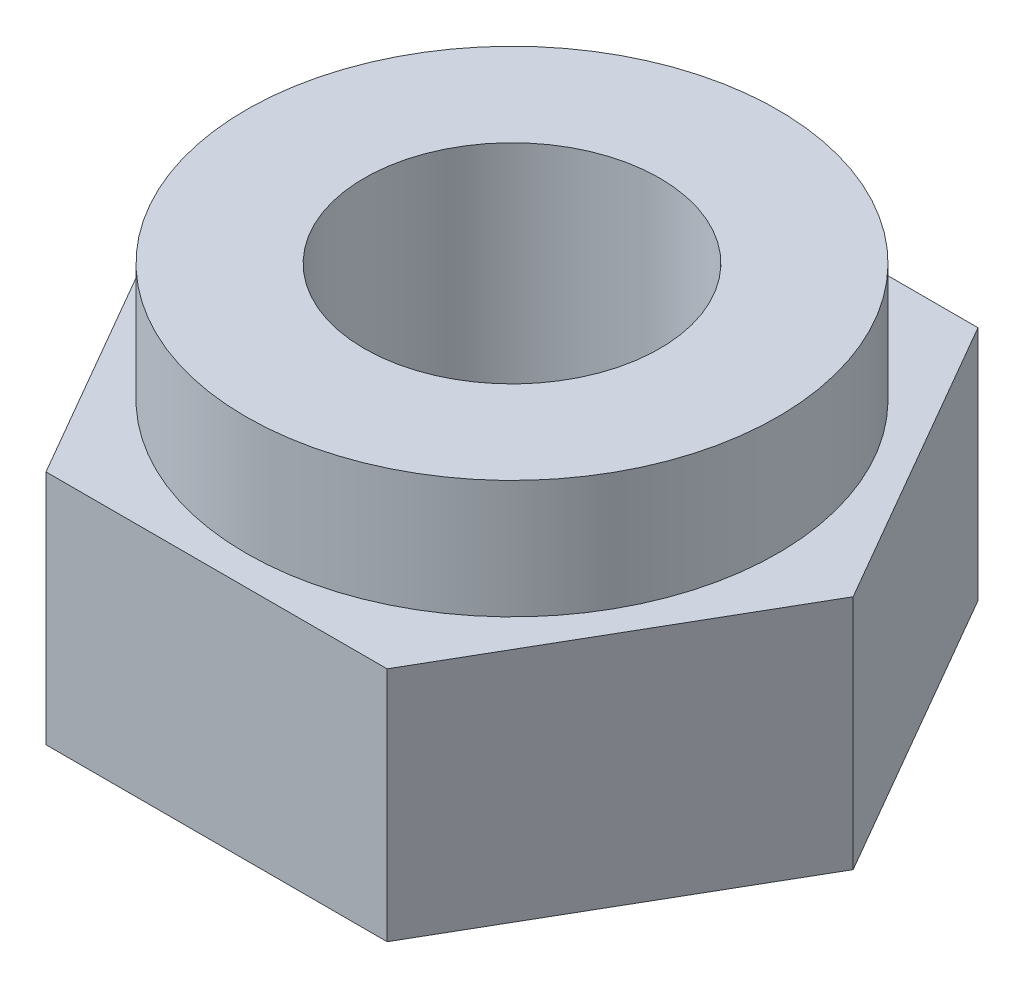
ISO-10303-21;
HEADER;
FILE_DESCRIPTION(('STEP AP214'),'2;1');
FILE_NAME('part.step','',(''),(''),'','','');
FILE_SCHEMA(('AUTOMOTIVE_DESIGN { 1 0 10303 214 1 1 1 1 }'));
ENDSEC;
DATA;
#1=APPLICATION_CONTEXT('core data for automotive mechanical design processes');
#2=APPLICATION_PROTOCOL_DEFINITION('international standard','automotive_design',2000,#1);
#3=PRODUCT_CONTEXT('',#1,'mechanical');
#4=PRODUCT('Part','Part','',(#3));
#5=PRODUCT_RELATED_PRODUCT_CATEGORY('part','',(#4));
#6=PRODUCT_DEFINITION_FORMATION('','',#4);
#7=PRODUCT_DEFINITION_CONTEXT('part definition',#1,'design');
#8=PRODUCT_DEFINITION('design','',#6,#7);
#9=PRODUCT_DEFINITION_SHAPE('','',#8);
#10=(LENGTH_UNIT() NAMED_UNIT(*) SI_UNIT(.MILLI.,.METRE.));
#11=(NAMED_UNIT(*) PLANE_ANGLE_UNIT() SI_UNIT($,.RADIAN.));
#12=(NAMED_UNIT(*) SI_UNIT($,.STERADIAN.) SOLID_ANGLE_UNIT());
#13=UNCERTAINTY_MEASURE_WITH_UNIT(LENGTH_MEASURE(1.E-05),#10,'distance_accuracy_value','');
#14=(GEOMETRIC_REPRESENTATION_CONTEXT(3) GLOBAL_UNCERTAINTY_ASSIGNED_CONTEXT((#13)) GLOBAL_UNIT_ASSIGNED_CONTEXT((#10,
#11,#12)) REPRESENTATION_CONTEXT('',''));
#15=CARTESIAN_POINT('',(0.,0.,0.));
#16=DIRECTION('',(0.,0.,1.));
#17=DIRECTION('',(1.,0.,0.));
#18=AXIS2_PLACEMENT_3D('',#15,#16,#17);
#19=CARTESIAN_POINT('',(1.44337567297409,3.,2.49999999999999));
#20=DIRECTION('',(-0.866025403784441,0.,-0.499999999999995));
#21=DIRECTION('',(-0.499999999999995,0.,0.866025403784442));
#22=AXIS2_PLACEMENT_3D('',#19,#20,#21);
#23=PLANE('',#22);
#24=DIRECTION('',(0.499999999999995,0.,-0.866025403784442));
#25=VECTOR('',#24,1.);
#26=CARTESIAN_POINT('',(1.44337567297409,2.,2.49999999999999));
#27=LINE('',#26,#25);
#28=CARTESIAN_POINT('',(1.44337567297409,2.,2.49999999999999));
#29=VERTEX_POINT('',#28);
#30=CARTESIAN_POINT('',(2.88675134594813,2.,0.));
#31=VERTEX_POINT('',#30);
#32=EDGE_CURVE('E91',#29,#31,#27,.T.);
#33=ORIENTED_EDGE('',*,*,#32,.F.);
#34=DIRECTION('',(0.,-1.,0.));
#35=VECTOR('',#34,1.);
#36=CARTESIAN_POINT('',(1.44337567297409,3.,2.49999999999999));
#37=LINE('',#36,#35);
#38=CARTESIAN_POINT('',(1.44337567297409,0.,2.49999999999999));
#39=VERTEX_POINT('',#38);
#40=EDGE_CURVE('E61',#29,#39,#37,.T.);
#41=ORIENTED_EDGE('',*,*,#40,.T.);
#42=DIRECTION('',(0.499999999999995,0.,-0.866025403784442));
#43=VECTOR('',#42,1.);
#44=CARTESIAN_POINT('',(1.44337567297409,0.,2.49999999999999));
#45=LINE('',#44,#43);
#46=CARTESIAN_POINT('',(2.88675134594813,0.,0.));
#47=VERTEX_POINT('',#46);
#48=EDGE_CURVE('E124',#39,#47,#45,.T.);
#49=ORIENTED_EDGE('',*,*,#48,.T.);
#50=DIRECTION('',(0.,-1.,0.));
#51=VECTOR('',#50,1.);
#52=CARTESIAN_POINT('',(2.88675134594813,3.,0.));
#53=LINE('',#52,#51);
#54=EDGE_CURVE('E47',#31,#47,#53,.T.);
#55=ORIENTED_EDGE('',*,*,#54,.F.);
#56=EDGE_LOOP('',(#33,#41,#49,#55));
#57=FACE_BOUND('',#56,.T.);
#58=ADVANCED_FACE('F40',(#57),#23,.F.);
#59=CARTESIAN_POINT('',(2.88675134594813,3.,0.));
#60=DIRECTION('',(-0.866025403784438,0.,0.500000000000001));
#61=DIRECTION('',(0.500000000000001,0.,0.866025403784438));
#62=AXIS2_PLACEMENT_3D('',#59,#60,#61);
#63=PLANE('',#62);
#64=DIRECTION('',(-0.500000000000001,0.,-0.866025403784438));
#65=VECTOR('',#64,1.);
#66=CARTESIAN_POINT('',(2.88675134594813,2.,0.));
#67=LINE('',#66,#65);
#68=CARTESIAN_POINT('',(1.44337567297406,2.,-2.50000000000001));
#69=VERTEX_POINT('',#68);
#70=EDGE_CURVE('E97',#31,#69,#67,.T.);
#71=ORIENTED_EDGE('',*,*,#70,.F.);
#72=ORIENTED_EDGE('',*,*,#54,.T.);
#73=DIRECTION('',(-0.500000000000001,0.,-0.866025403784438));
#74=VECTOR('',#73,1.);
#75=CARTESIAN_POINT('',(2.88675134594813,0.,0.));
#76=LINE('',#75,#74);
#77=CARTESIAN_POINT('',(1.44337567297406,0.,-2.50000000000001));
#78=VERTEX_POINT('',#77);
#79=EDGE_CURVE('E120',#47,#78,#76,.T.);
#80=ORIENTED_EDGE('',*,*,#79,.T.);
#81=DIRECTION('',(0.,-1.,0.));
#82=VECTOR('',#81,1.);
#83=CARTESIAN_POINT('',(1.44337567297406,3.,-2.50000000000001));
#84=LINE('',#83,#82);
#85=EDGE_CURVE('E114',#69,#78,#84,.T.);
#86=ORIENTED_EDGE('',*,*,#85,.F.);
#87=EDGE_LOOP('',(#71,#72,#80,#86));
#88=FACE_BOUND('',#87,.T.);
#89=ADVANCED_FACE('F118',(#88),#63,.F.);
#90=CARTESIAN_POINT('',(1.44337567297406,3.,-2.50000000000001));
#91=DIRECTION('',(0.,0.,1.));
#92=DIRECTION('',(1.,0.,0.));
#93=AXIS2_PLACEMENT_3D('',#90,#91,#92);
#94=PLANE('',#93);
#95=DIRECTION('',(-1.,0.,0.));
#96=VECTOR('',#95,1.);
#97=CARTESIAN_POINT('',(1.44337567297406,2.,-2.50000000000001));
#98=LINE('',#97,#96);
#99=CARTESIAN_POINT('',(-1.44337567297408,2.,-2.5));
#100=VERTEX_POINT('',#99);
#101=EDGE_CURVE('E151',#69,#100,#98,.T.);
#102=ORIENTED_EDGE('',*,*,#101,.F.);
#103=ORIENTED_EDGE('',*,*,#85,.T.);
#104=DIRECTION('',(-1.,0.,0.));
#105=VECTOR('',#104,1.);
#106=CARTESIAN_POINT('',(1.44337567297406,0.,-2.50000000000001));
#107=LINE('',#106,#105);
#108=CARTESIAN_POINT('',(-1.44337567297408,0.,-2.5));
#109=VERTEX_POINT('',#108);
#110=EDGE_CURVE('E127',#78,#109,#107,.T.);
#111=ORIENTED_EDGE('',*,*,#110,.T.);
#112=DIRECTION('',(0.,-1.,0.));
#113=VECTOR('',#112,1.);
#114=CARTESIAN_POINT('',(-1.44337567297408,3.,-2.5));
#115=LINE('',#114,#113);
#116=EDGE_CURVE('E112',#100,#109,#115,.T.);
#117=ORIENTED_EDGE('',*,*,#116,.F.);
#118=EDGE_LOOP('',(#102,#103,#111,#117));
#119=FACE_BOUND('',#118,.T.);
#120=ADVANCED_FACE('F150',(#119),#94,.F.);
#121=CARTESIAN_POINT('',(-1.44337567297408,3.,-2.5));
#122=DIRECTION('',(0.866025403784441,0.,0.499999999999995));
#123=DIRECTION('',(0.499999999999995,0.,-0.866025403784442));
#124=AXIS2_PLACEMENT_3D('',#121,#122,#123);
#125=PLANE('',#124);
#126=DIRECTION('',(-0.499999999999995,0.,0.866025403784442));
#127=VECTOR('',#126,1.);
#128=CARTESIAN_POINT('',(-1.44337567297408,2.,-2.5));
#129=LINE('',#128,#127);
#130=CARTESIAN_POINT('',(-2.88675134594813,2.,0.));
#131=VERTEX_POINT('',#130);
#132=EDGE_CURVE('E147',#100,#131,#129,.T.);
#133=ORIENTED_EDGE('',*,*,#132,.F.);
#134=ORIENTED_EDGE('',*,*,#116,.T.);
#135=DIRECTION('',(-0.499999999999995,0.,0.866025403784441));
#136=VECTOR('',#135,1.);
#137=CARTESIAN_POINT('',(-1.44337567297408,0.,-2.5));
#138=LINE('',#137,#136);
#139=CARTESIAN_POINT('',(-2.88675134594813,0.,0.));
#140=VERTEX_POINT('',#139);
#141=EDGE_CURVE('E136',#109,#140,#138,.T.);
#142=ORIENTED_EDGE('',*,*,#141,.T.);
#143=DIRECTION('',(0.,-1.,0.));
#144=VECTOR('',#143,1.);
#145=CARTESIAN_POINT('',(-2.88675134594813,3.,0.));
#146=LINE('',#145,#144);
#147=EDGE_CURVE('E105',#131,#140,#146,.T.);
#148=ORIENTED_EDGE('',*,*,#147,.F.);
#149=EDGE_LOOP('',(#133,#134,#142,#148));
#150=FACE_BOUND('',#149,.T.);
#151=ADVANCED_FACE('F145',(#150),#125,.F.);
#152=CARTESIAN_POINT('',(-2.88675134594813,3.,0.));
#153=DIRECTION('',(0.866025403784434,0.,-0.500000000000007));
#154=DIRECTION('',(-0.500000000000007,0.,-0.866025403784435));
#155=AXIS2_PLACEMENT_3D('',#152,#153,#154);
#156=PLANE('',#155);
#157=DIRECTION('',(0.500000000000007,0.,0.866025403784435));
#158=VECTOR('',#157,1.);
#159=CARTESIAN_POINT('',(-2.88675134594813,2.,0.));
#160=LINE('',#159,#158);
#161=CARTESIAN_POINT('',(-1.44337567297404,2.,2.50000000000002));
#162=VERTEX_POINT('',#161);
#163=EDGE_CURVE('E53',#131,#162,#160,.T.);
#164=ORIENTED_EDGE('',*,*,#163,.F.);
#165=ORIENTED_EDGE('',*,*,#147,.T.);
#166=DIRECTION('',(0.500000000000007,0.,0.866025403784434));
#167=VECTOR('',#166,1.);
#168=CARTESIAN_POINT('',(-2.88675134594813,0.,0.));
#169=LINE('',#168,#167);
#170=CARTESIAN_POINT('',(-1.44337567297404,0.,2.50000000000002));
#171=VERTEX_POINT('',#170);
#172=EDGE_CURVE('E107',#140,#171,#169,.T.);
#173=ORIENTED_EDGE('',*,*,#172,.T.);
#174=DIRECTION('',(0.,-1.,0.));
#175=VECTOR('',#174,1.);
#176=CARTESIAN_POINT('',(-1.44337567297404,3.,2.50000000000002));
#177=LINE('',#176,#175);
#178=EDGE_CURVE('E103',#162,#171,#177,.T.);
#179=ORIENTED_EDGE('',*,*,#178,.F.);
#180=EDGE_LOOP('',(#164,#165,#173,#179));
#181=FACE_BOUND('',#180,.T.);
#182=ADVANCED_FACE('F141',(#181),#156,.F.);
#183=CARTESIAN_POINT('',(-1.44337567297404,3.,2.50000000000002));
#184=DIRECTION('',(0.,0.,-1.));
#185=DIRECTION('',(-1.,0.,0.));
#186=AXIS2_PLACEMENT_3D('',#183,#184,#185);
#187=PLANE('',#186);
#188=DIRECTION('',(1.,0.,0.));
#189=VECTOR('',#188,1.);
#190=CARTESIAN_POINT('',(-1.44337567297404,2.,2.50000000000002));
#191=LINE('',#190,#189);
#192=EDGE_CURVE('E12',#162,#29,#191,.T.);
#193=ORIENTED_EDGE('',*,*,#192,.F.);
#194=ORIENTED_EDGE('',*,*,#178,.T.);
#195=DIRECTION('',(1.,0.,0.));
#196=VECTOR('',#195,1.);
#197=CARTESIAN_POINT('',(-1.44337567297404,0.,2.50000000000002));
#198=LINE('',#197,#196);
#199=EDGE_CURVE('E101',#171,#39,#198,.T.);
#200=ORIENTED_EDGE('',*,*,#199,.T.);
#201=ORIENTED_EDGE('',*,*,#40,.F.);
#202=EDGE_LOOP('',(#193,#194,#200,#201));
#203=FACE_BOUND('',#202,.T.);
#204=ADVANCED_FACE('F99',(#203),#187,.F.);
#205=CARTESIAN_POINT('',(0.,3.,0.));
#206=DIRECTION('',(0.,1.,0.));
#207=DIRECTION('',(0.,0.,1.));
#208=AXIS2_PLACEMENT_3D('',#205,#206,#207);
#209=PLANE('',#208);
#210=CARTESIAN_POINT('',(0.,3.,0.));
#211=DIRECTION('',(0.,1.,0.));
#212=DIRECTION('',(0.,0.,1.));
#213=AXIS2_PLACEMENT_3D('',#210,#211,#212);
#214=CIRCLE('',#213,1.25);
#215=CARTESIAN_POINT('',(0.,3.,1.25));
#216=VERTEX_POINT('',#215);
#217=EDGE_CURVE('E96',#216,#216,#214,.T.);
#218=ORIENTED_EDGE('',*,*,#217,.F.);
#219=EDGE_LOOP('',(#218));
#220=FACE_BOUND('',#219,.T.);
#221=CARTESIAN_POINT('',(0.,3.,0.));
#222=DIRECTION('',(0.,1.,0.));
#223=DIRECTION('',(0.,0.,1.));
#224=AXIS2_PLACEMENT_3D('',#221,#222,#223);
#225=CIRCLE('',#224,2.25);
#226=CARTESIAN_POINT('',(0.,3.,2.25));
#227=VERTEX_POINT('',#226);
#228=EDGE_CURVE('E168',#227,#227,#225,.T.);
#229=ORIENTED_EDGE('',*,*,#228,.T.);
#230=EDGE_LOOP('',(#229));
#231=FACE_BOUND('',#230,.T.);
#232=ADVANCED_FACE('F162',(#220,#231),#209,.T.);
#233=CARTESIAN_POINT('',(0.,0.,0.));
#234=DIRECTION('',(0.,1.,0.));
#235=DIRECTION('',(0.,0.,1.));
#236=AXIS2_PLACEMENT_3D('',#233,#234,#235);
#237=PLANE('',#236);
#238=CARTESIAN_POINT('',(0.,0.,0.));
#239=DIRECTION('',(0.,1.,0.));
#240=DIRECTION('',(0.,0.,1.));
#241=AXIS2_PLACEMENT_3D('',#238,#239,#240);
#242=CIRCLE('',#241,1.25);
#243=CARTESIAN_POINT('',(0.,0.,1.25));
#244=VERTEX_POINT('',#243);
#245=EDGE_CURVE('E129',#244,#244,#242,.F.);
#246=ORIENTED_EDGE('',*,*,#245,.F.);
#247=EDGE_LOOP('',(#246));
#248=FACE_BOUND('',#247,.T.);
#249=ORIENTED_EDGE('',*,*,#48,.F.);
#250=ORIENTED_EDGE('',*,*,#199,.F.);
#251=ORIENTED_EDGE('',*,*,#172,.F.);
#252=ORIENTED_EDGE('',*,*,#141,.F.);
#253=ORIENTED_EDGE('',*,*,#110,.F.);
#254=ORIENTED_EDGE('',*,*,#79,.F.);
#255=EDGE_LOOP('',(#249,#250,#251,#252,#253,#254));
#256=FACE_BOUND('',#255,.T.);
#257=ADVANCED_FACE('F123',(#248,#256),#237,.F.);
#258=CARTESIAN_POINT('',(0.,-0.00100000000000013,0.));
#259=DIRECTION('',(0.,1.,0.));
#260=DIRECTION('',(0.,0.,1.));
#261=AXIS2_PLACEMENT_3D('',#258,#259,#260);
#262=CYLINDRICAL_SURFACE('',#261,1.25);
#263=CARTESIAN_POINT('',(0.,3.,1.25));
#264=CARTESIAN_POINT('',(0.,2.96875,1.25));
#265=CARTESIAN_POINT('',(0.,2.9375,1.25));
#266=CARTESIAN_POINT('',(0.,2.875,1.25));
#267=CARTESIAN_POINT('',(0.,2.84375,1.25));
#268=CARTESIAN_POINT('',(0.,2.78125,1.25));
#269=CARTESIAN_POINT('',(0.,2.75,1.25));
#270=CARTESIAN_POINT('',(0.,2.6875,1.25));
#271=CARTESIAN_POINT('',(0.,2.65625,1.25));
#272=CARTESIAN_POINT('',(0.,2.59375,1.25));
#273=CARTESIAN_POINT('',(0.,2.5625,1.25));
#274=CARTESIAN_POINT('',(0.,2.5,1.25));
#275=CARTESIAN_POINT('',(0.,2.46875,1.25));
#276=CARTESIAN_POINT('',(0.,2.40625,1.25));
#277=CARTESIAN_POINT('',(0.,2.375,1.25));
#278=CARTESIAN_POINT('',(0.,2.3125,1.25));
#279=CARTESIAN_POINT('',(0.,2.28125,1.25));
#280=CARTESIAN_POINT('',(0.,2.21875,1.25));
#281=CARTESIAN_POINT('',(0.,2.1875,1.25));
#282=CARTESIAN_POINT('',(0.,2.125,1.25));
#283=CARTESIAN_POINT('',(0.,2.09375,1.25));
#284=CARTESIAN_POINT('',(0.,2.03125,1.25));
#285=CARTESIAN_POINT('',(0.,2.,1.25));
#286=CARTESIAN_POINT('',(0.,1.9375,1.25));
#287=CARTESIAN_POINT('',(0.,1.90625,1.25));
#288=CARTESIAN_POINT('',(0.,1.84375,1.25));
#289=CARTESIAN_POINT('',(0.,1.8125,1.25));
#290=CARTESIAN_POINT('',(0.,1.75,1.25));
#291=CARTESIAN_POINT('',(0.,1.71875,1.25));
#292=CARTESIAN_POINT('',(0.,1.65625,1.25));
#293=CARTESIAN_POINT('',(0.,1.625,1.25));
#294=CARTESIAN_POINT('',(0.,1.5625,1.25));
#295=CARTESIAN_POINT('',(0.,1.53125,1.25));
#296=CARTESIAN_POINT('',(0.,1.46875,1.25));
#297=CARTESIAN_POINT('',(0.,1.4375,1.25));
#298=CARTESIAN_POINT('',(0.,1.375,1.25));
#299=CARTESIAN_POINT('',(0.,1.34375,1.25));
#300=CARTESIAN_POINT('',(0.,1.28125,1.25));
#301=CARTESIAN_POINT('',(0.,1.25,1.25));
#302=CARTESIAN_POINT('',(0.,1.1875,1.25));
#303=CARTESIAN_POINT('',(0.,1.15625,1.25));
#304=CARTESIAN_POINT('',(0.,1.09375,1.25));
#305=CARTESIAN_POINT('',(0.,1.0625,1.25));
#306=CARTESIAN_POINT('',(0.,1.,1.25));
#307=CARTESIAN_POINT('',(0.,0.96875,1.25));
#308=CARTESIAN_POINT('',(0.,0.90625,1.25));
#309=CARTESIAN_POINT('',(0.,0.875,1.25));
#310=CARTESIAN_POINT('',(0.,0.8125,1.25));
#311=CARTESIAN_POINT('',(0.,0.78125,1.25));
#312=CARTESIAN_POINT('',(0.,0.71875,1.25));
#313=CARTESIAN_POINT('',(0.,0.6875,1.25));
#314=CARTESIAN_POINT('',(0.,0.625,1.25));
#315=CARTESIAN_POINT('',(0.,0.59375,1.25));
#316=CARTESIAN_POINT('',(0.,0.53125,1.25));
#317=CARTESIAN_POINT('',(0.,0.5,1.25));
#318=CARTESIAN_POINT('',(0.,0.4375,1.25));
#319=CARTESIAN_POINT('',(0.,0.40625,1.25));
#320=CARTESIAN_POINT('',(0.,0.34375,1.25));
#321=CARTESIAN_POINT('',(0.,0.3125,1.25));
#322=CARTESIAN_POINT('',(0.,0.25,1.25));
#323=CARTESIAN_POINT('',(0.,0.21875,1.25));
#324=CARTESIAN_POINT('',(0.,0.15625,1.25));
#325=CARTESIAN_POINT('',(0.,0.125,1.25));
#326=CARTESIAN_POINT('',(0.,0.0625000000000001,1.25));
#327=CARTESIAN_POINT('',(0.,0.0312500000000001,1.25));
#328=CARTESIAN_POINT('',(0.,0.,1.25));
#329=B_SPLINE_CURVE_WITH_KNOTS('',3,(#263,#264,#265,#266,#267,#268,#269,#270,#271,#272,#273,
#274,#275,#276,#277,#278,#279,#280,#281,#282,#283,#284,#285,#286,#287,#288,#289,#290,#291,#292,
#293,#294,#295,#296,#297,#298,#299,#300,#301,#302,#303,#304,#305,#306,#307,#308,#309,#310,#311,
#312,#313,#314,#315,#316,#317,#318,#319,#320,#321,#322,#323,#324,#325,#326,#327,#328),
.UNSPECIFIED.,.F.,.F.,(4,2,2,2,2,2,2,2,2,2,2,2,2,2,2,2,2,2,2,2,2,2,2,2,2,2,2,2,2,2,2,2,4),(0.,
0.0937500000000001,0.1875,0.28125,0.375,0.46875,0.5625,0.65625,0.75,0.84375,0.9375,1.03125,
1.125,1.21875,1.3125,1.40625,1.5,1.59375,1.6875,1.78125,1.875,1.96875,2.0625,2.15625,2.25,
2.34375,2.4375,2.53125,2.625,2.71875,2.8125,2.90625,3.),.UNSPECIFIED.);
#330=EDGE_CURVE('BSEAM159',#216,#244,#329,.T.);
#331=ORIENTED_EDGE('',*,*,#217,.T.);
#332=ORIENTED_EDGE('',*,*,#245,.T.);
#333=ORIENTED_EDGE('',*,*,#330,.T.);
#334=ORIENTED_EDGE('',*,*,#330,.F.);
#335=EDGE_LOOP('',(#331,#333,#332,#334));
#336=FACE_BOUND('',#335,.T.);
#337=ADVANCED_FACE('F159',(#336),#262,.F.);
#338=CARTESIAN_POINT('',(0.,2.,0.));
#339=DIRECTION('',(0.,1.,0.));
#340=DIRECTION('',(0.,0.,1.));
#341=AXIS2_PLACEMENT_3D('',#338,#339,#340);
#342=PLANE('',#341);
#343=CARTESIAN_POINT('',(0.,2.,0.));
#344=DIRECTION('',(0.,1.,0.));
#345=DIRECTION('',(0.,0.,1.));
#346=AXIS2_PLACEMENT_3D('',#343,#344,#345);
#347=CIRCLE('',#346,2.25);
#348=CARTESIAN_POINT('',(0.,2.,2.25));
#349=VERTEX_POINT('',#348);
#350=EDGE_CURVE('E170',#349,#349,#347,.T.);
#351=ORIENTED_EDGE('',*,*,#350,.F.);
#352=EDGE_LOOP('',(#351));
#353=FACE_BOUND('',#352,.T.);
#354=ORIENTED_EDGE('',*,*,#32,.T.);
#355=ORIENTED_EDGE('',*,*,#70,.T.);
#356=ORIENTED_EDGE('',*,*,#101,.T.);
#357=ORIENTED_EDGE('',*,*,#132,.T.);
#358=ORIENTED_EDGE('',*,*,#163,.T.);
#359=ORIENTED_EDGE('',*,*,#192,.T.);
#360=EDGE_LOOP('',(#354,#355,#356,#357,#358,#359));
#361=FACE_BOUND('',#360,.T.);
#362=ADVANCED_FACE('F90',(#353,#361),#342,.T.);
#363=CARTESIAN_POINT('',(0.,2.,0.));
#364=DIRECTION('',(0.,1.,0.));
#365=DIRECTION('',(0.,0.,1.));
#366=AXIS2_PLACEMENT_3D('',#363,#364,#365);
#367=CYLINDRICAL_SURFACE('',#366,2.25);
#368=ORIENTED_EDGE('',*,*,#350,.T.);
#369=EDGE_LOOP('',(#368));
#370=FACE_BOUND('',#369,.T.);
#371=ORIENTED_EDGE('',*,*,#228,.F.);
#372=EDGE_LOOP('',(#371));
#373=FACE_BOUND('',#372,.T.);
#374=ADVANCED_FACE('F176',(#370,#373),#367,.T.);
#375=CLOSED_SHELL('',(#58,#89,#120,#151,#182,#204,#232,#257,#337,#362,#374));
#376=MANIFOLD_SOLID_BREP('B2',#375);
#377=ADVANCED_BREP_SHAPE_REPRESENTATION('',(#18,#376),#14);
#378=SHAPE_DEFINITION_REPRESENTATION(#9,#377);
ENDSEC;
END-ISO-10303-21;
